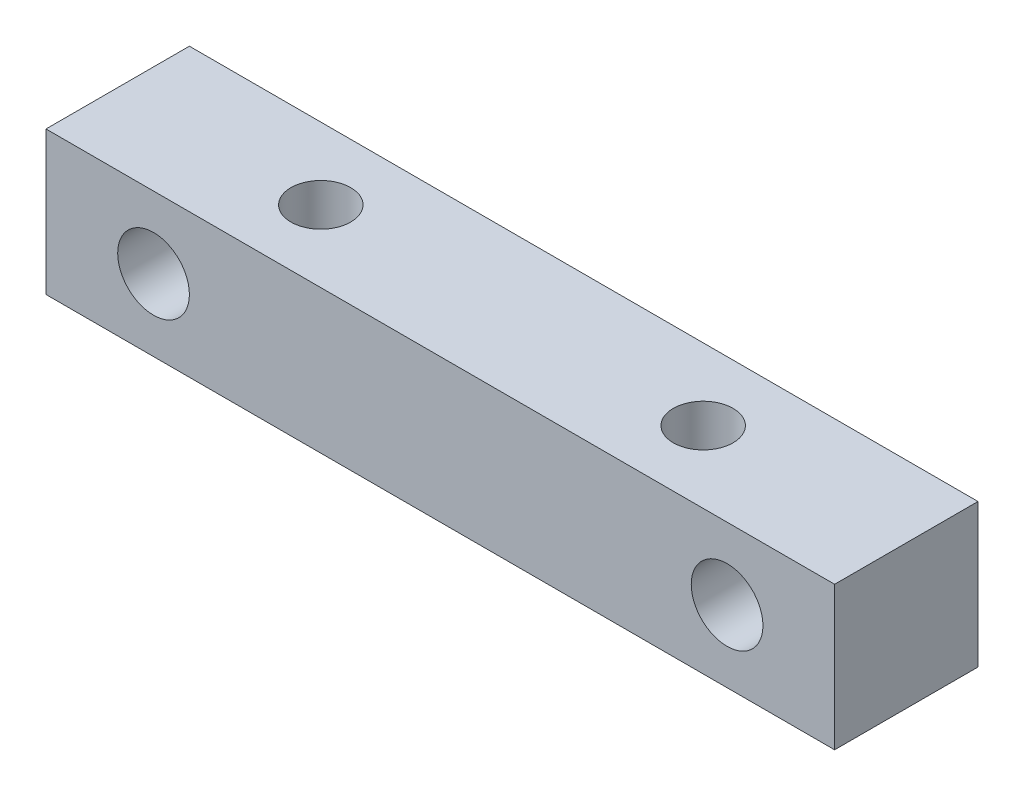
ISO-10303-21;
HEADER;
FILE_DESCRIPTION(('STEP AP214'),'2;1');
FILE_NAME('part.step','',(''),(''),'','','');
FILE_SCHEMA(('AUTOMOTIVE_DESIGN { 1 0 10303 214 1 1 1 1 }'));
ENDSEC;
DATA;
#1=APPLICATION_CONTEXT('core data for automotive mechanical design processes');
#2=APPLICATION_PROTOCOL_DEFINITION('international standard','automotive_design',2000,#1);
#3=PRODUCT_CONTEXT('',#1,'mechanical');
#4=PRODUCT('Part','Part','',(#3));
#5=PRODUCT_RELATED_PRODUCT_CATEGORY('part','',(#4));
#6=PRODUCT_DEFINITION_FORMATION('','',#4);
#7=PRODUCT_DEFINITION_CONTEXT('part definition',#1,'design');
#8=PRODUCT_DEFINITION('design','',#6,#7);
#9=PRODUCT_DEFINITION_SHAPE('','',#8);
#10=(LENGTH_UNIT() NAMED_UNIT(*) SI_UNIT(.MILLI.,.METRE.));
#11=(NAMED_UNIT(*) PLANE_ANGLE_UNIT() SI_UNIT($,.RADIAN.));
#12=(NAMED_UNIT(*) SI_UNIT($,.STERADIAN.) SOLID_ANGLE_UNIT());
#13=UNCERTAINTY_MEASURE_WITH_UNIT(LENGTH_MEASURE(1.E-05),#10,'distance_accuracy_value','');
#14=(GEOMETRIC_REPRESENTATION_CONTEXT(3) GLOBAL_UNCERTAINTY_ASSIGNED_CONTEXT((#13)) GLOBAL_UNIT_ASSIGNED_CONTEXT((#10,
#11,#12)) REPRESENTATION_CONTEXT('',''));
#15=CARTESIAN_POINT('',(0.,0.,0.));
#16=DIRECTION('',(0.,0.,1.));
#17=DIRECTION('',(1.,0.,0.));
#18=AXIS2_PLACEMENT_3D('',#15,#16,#17);
#19=CARTESIAN_POINT('',(0.,0.,6.));
#20=DIRECTION('',(0.,0.,1.));
#21=DIRECTION('',(1.,0.,0.));
#22=AXIS2_PLACEMENT_3D('',#19,#20,#21);
#23=PLANE('',#22);
#24=DIRECTION('',(0.,1.,0.));
#25=VECTOR('',#24,1.);
#26=CARTESIAN_POINT('',(-16.5,0.,6.));
#27=LINE('',#26,#25);
#28=CARTESIAN_POINT('',(-16.5,-21.,6.));
#29=VERTEX_POINT('',#28);
#30=CARTESIAN_POINT('',(-16.5,-15.,6.));
#31=VERTEX_POINT('',#30);
#32=EDGE_CURVE('E107',#29,#31,#27,.T.);
#33=ORIENTED_EDGE('',*,*,#32,.F.);
#34=DIRECTION('',(-1.,0.,0.));
#35=VECTOR('',#34,1.);
#36=CARTESIAN_POINT('',(26.5,-21.,6.));
#37=LINE('',#36,#35);
#38=CARTESIAN_POINT('',(16.5,-21.,6.));
#39=VERTEX_POINT('',#38);
#40=EDGE_CURVE('E127',#39,#29,#37,.T.);
#41=ORIENTED_EDGE('',*,*,#40,.F.);
#42=DIRECTION('',(0.,-1.,0.));
#43=VECTOR('',#42,1.);
#44=CARTESIAN_POINT('',(16.5,0.,6.));
#45=LINE('',#44,#43);
#46=CARTESIAN_POINT('',(16.5,-15.,6.));
#47=VERTEX_POINT('',#46);
#48=EDGE_CURVE('E81',#47,#39,#45,.T.);
#49=ORIENTED_EDGE('',*,*,#48,.F.);
#50=DIRECTION('',(1.,0.,0.));
#51=VECTOR('',#50,1.);
#52=CARTESIAN_POINT('',(-22.5,-15.,6.));
#53=LINE('',#52,#51);
#54=EDGE_CURVE('E126',#31,#47,#53,.T.);
#55=ORIENTED_EDGE('',*,*,#54,.F.);
#56=EDGE_LOOP('',(#33,#41,#49,#55));
#57=FACE_BOUND('',#56,.T.);
#58=CARTESIAN_POINT('',(-12.,-18.,6.));
#59=DIRECTION('',(0.,0.,1.));
#60=DIRECTION('',(1.,0.,0.));
#61=AXIS2_PLACEMENT_3D('',#58,#59,#60);
#62=CIRCLE('',#61,1.5);
#63=CARTESIAN_POINT('',(-10.5,-18.,6.));
#64=VERTEX_POINT('',#63);
#65=EDGE_CURVE('E139',#64,#64,#62,.T.);
#66=ORIENTED_EDGE('',*,*,#65,.F.);
#67=EDGE_LOOP('',(#66));
#68=FACE_BOUND('',#67,.T.);
#69=CARTESIAN_POINT('',(12.,-18.,6.));
#70=DIRECTION('',(0.,0.,1.));
#71=DIRECTION('',(1.,0.,0.));
#72=AXIS2_PLACEMENT_3D('',#69,#70,#71);
#73=CIRCLE('',#72,1.5);
#74=CARTESIAN_POINT('',(13.5,-18.,6.));
#75=VERTEX_POINT('',#74);
#76=EDGE_CURVE('E141',#75,#75,#73,.T.);
#77=ORIENTED_EDGE('',*,*,#76,.F.);
#78=EDGE_LOOP('',(#77));
#79=FACE_BOUND('',#78,.T.);
#80=ADVANCED_FACE('F66',(#57,#68,#79),#23,.T.);
#81=CARTESIAN_POINT('',(0.,0.,0.));
#82=DIRECTION('',(0.,0.,1.));
#83=DIRECTION('',(1.,0.,0.));
#84=AXIS2_PLACEMENT_3D('',#81,#82,#83);
#85=PLANE('',#84);
#86=CARTESIAN_POINT('',(-12.,-18.,0.));
#87=DIRECTION('',(0.,0.,-1.));
#88=DIRECTION('',(-1.,0.,0.));
#89=AXIS2_PLACEMENT_3D('',#86,#87,#88);
#90=CIRCLE('',#89,1.5);
#91=CARTESIAN_POINT('',(-13.5,-18.,0.));
#92=VERTEX_POINT('',#91);
#93=EDGE_CURVE('E146',#92,#92,#90,.T.);
#94=ORIENTED_EDGE('',*,*,#93,.F.);
#95=EDGE_LOOP('',(#94));
#96=FACE_BOUND('',#95,.T.);
#97=CARTESIAN_POINT('',(12.,-18.,0.));
#98=DIRECTION('',(0.,0.,-1.));
#99=DIRECTION('',(-1.,0.,0.));
#100=AXIS2_PLACEMENT_3D('',#97,#98,#99);
#101=CIRCLE('',#100,1.5);
#102=CARTESIAN_POINT('',(10.5,-18.,0.));
#103=VERTEX_POINT('',#102);
#104=EDGE_CURVE('E147',#103,#103,#101,.T.);
#105=ORIENTED_EDGE('',*,*,#104,.F.);
#106=EDGE_LOOP('',(#105));
#107=FACE_BOUND('',#106,.T.);
#108=DIRECTION('',(-1.,0.,0.));
#109=VECTOR('',#108,1.);
#110=CARTESIAN_POINT('',(26.5,-21.,0.));
#111=LINE('',#110,#109);
#112=CARTESIAN_POINT('',(16.5,-21.,0.));
#113=VERTEX_POINT('',#112);
#114=CARTESIAN_POINT('',(-16.5,-21.,0.));
#115=VERTEX_POINT('',#114);
#116=EDGE_CURVE('E119',#113,#115,#111,.T.);
#117=ORIENTED_EDGE('',*,*,#116,.T.);
#118=DIRECTION('',(0.,-1.,0.));
#119=VECTOR('',#118,1.);
#120=CARTESIAN_POINT('',(-16.5,-15.,0.));
#121=LINE('',#120,#119);
#122=CARTESIAN_POINT('',(-16.5,-15.,0.));
#123=VERTEX_POINT('',#122);
#124=EDGE_CURVE('E88',#123,#115,#121,.T.);
#125=ORIENTED_EDGE('',*,*,#124,.F.);
#126=DIRECTION('',(1.,0.,0.));
#127=VECTOR('',#126,1.);
#128=CARTESIAN_POINT('',(-22.5,-15.,0.));
#129=LINE('',#128,#127);
#130=CARTESIAN_POINT('',(16.5,-15.,0.));
#131=VERTEX_POINT('',#130);
#132=EDGE_CURVE('E117',#123,#131,#129,.T.);
#133=ORIENTED_EDGE('',*,*,#132,.T.);
#134=DIRECTION('',(0.,1.,0.));
#135=VECTOR('',#134,1.);
#136=CARTESIAN_POINT('',(16.5,-15.,0.));
#137=LINE('',#136,#135);
#138=EDGE_CURVE('E120',#113,#131,#137,.T.);
#139=ORIENTED_EDGE('',*,*,#138,.F.);
#140=EDGE_LOOP('',(#117,#125,#133,#139));
#141=FACE_BOUND('',#140,.T.);
#142=ADVANCED_FACE('F68',(#96,#107,#141),#85,.F.);
#143=CARTESIAN_POINT('',(-22.5,-15.,6.));
#144=DIRECTION('',(0.,1.,0.));
#145=DIRECTION('',(0.,0.,1.));
#146=AXIS2_PLACEMENT_3D('',#143,#144,#145);
#147=PLANE('',#146);
#148=DIRECTION('',(0.,0.,-1.));
#149=VECTOR('',#148,1.);
#150=CARTESIAN_POINT('',(-16.5,-15.,10.));
#151=LINE('',#150,#149);
#152=EDGE_CURVE('E104',#31,#123,#151,.T.);
#153=ORIENTED_EDGE('',*,*,#152,.F.);
#154=ORIENTED_EDGE('',*,*,#54,.T.);
#155=DIRECTION('',(0.,0.,-1.));
#156=VECTOR('',#155,1.);
#157=CARTESIAN_POINT('',(16.5,-15.,10.));
#158=LINE('',#157,#156);
#159=EDGE_CURVE('E125',#47,#131,#158,.T.);
#160=ORIENTED_EDGE('',*,*,#159,.T.);
#161=ORIENTED_EDGE('',*,*,#132,.F.);
#162=EDGE_LOOP('',(#153,#154,#160,#161));
#163=FACE_BOUND('',#162,.T.);
#164=CARTESIAN_POINT('',(8.,-15.,3.));
#165=DIRECTION('',(0.,1.,0.));
#166=DIRECTION('',(0.,0.,1.));
#167=AXIS2_PLACEMENT_3D('',#164,#165,#166);
#168=CIRCLE('',#167,1.25);
#169=CARTESIAN_POINT('',(8.,-15.,4.25));
#170=VERTEX_POINT('',#169);
#171=EDGE_CURVE('E150',#170,#170,#168,.T.);
#172=ORIENTED_EDGE('',*,*,#171,.F.);
#173=EDGE_LOOP('',(#172));
#174=FACE_BOUND('',#173,.T.);
#175=CARTESIAN_POINT('',(-8.,-15.,3.));
#176=DIRECTION('',(0.,1.,0.));
#177=DIRECTION('',(0.,0.,1.));
#178=AXIS2_PLACEMENT_3D('',#175,#176,#177);
#179=CIRCLE('',#178,1.25);
#180=CARTESIAN_POINT('',(-8.,-15.,4.25));
#181=VERTEX_POINT('',#180);
#182=EDGE_CURVE('E155',#181,#181,#179,.T.);
#183=ORIENTED_EDGE('',*,*,#182,.F.);
#184=EDGE_LOOP('',(#183));
#185=FACE_BOUND('',#184,.T.);
#186=ADVANCED_FACE('F123',(#163,#174,#185),#147,.T.);
#187=CARTESIAN_POINT('',(26.5,-21.,6.));
#188=DIRECTION('',(0.,-1.,0.));
#189=DIRECTION('',(0.,0.,-1.));
#190=AXIS2_PLACEMENT_3D('',#187,#188,#189);
#191=PLANE('',#190);
#192=DIRECTION('',(0.,0.,1.));
#193=VECTOR('',#192,1.);
#194=CARTESIAN_POINT('',(-16.5,-21.,6.));
#195=LINE('',#194,#193);
#196=EDGE_CURVE('E12',#115,#29,#195,.T.);
#197=ORIENTED_EDGE('',*,*,#196,.F.);
#198=ORIENTED_EDGE('',*,*,#116,.F.);
#199=DIRECTION('',(0.,0.,-1.));
#200=VECTOR('',#199,1.);
#201=CARTESIAN_POINT('',(16.5,-21.,6.));
#202=LINE('',#201,#200);
#203=EDGE_CURVE('E74',#39,#113,#202,.T.);
#204=ORIENTED_EDGE('',*,*,#203,.F.);
#205=ORIENTED_EDGE('',*,*,#40,.T.);
#206=EDGE_LOOP('',(#197,#198,#204,#205));
#207=FACE_BOUND('',#206,.T.);
#208=CARTESIAN_POINT('',(8.,-21.,3.));
#209=DIRECTION('',(0.,-1.,0.));
#210=DIRECTION('',(0.,0.,-1.));
#211=AXIS2_PLACEMENT_3D('',#208,#209,#210);
#212=CIRCLE('',#211,1.25);
#213=CARTESIAN_POINT('',(8.,-21.,1.75));
#214=VERTEX_POINT('',#213);
#215=EDGE_CURVE('E158',#214,#214,#212,.T.);
#216=ORIENTED_EDGE('',*,*,#215,.F.);
#217=EDGE_LOOP('',(#216));
#218=FACE_BOUND('',#217,.T.);
#219=CARTESIAN_POINT('',(-8.,-21.,3.));
#220=DIRECTION('',(0.,-1.,0.));
#221=DIRECTION('',(0.,0.,-1.));
#222=AXIS2_PLACEMENT_3D('',#219,#220,#221);
#223=CIRCLE('',#222,1.25);
#224=CARTESIAN_POINT('',(-8.,-21.,1.75));
#225=VERTEX_POINT('',#224);
#226=EDGE_CURVE('E159',#225,#225,#223,.T.);
#227=ORIENTED_EDGE('',*,*,#226,.F.);
#228=EDGE_LOOP('',(#227));
#229=FACE_BOUND('',#228,.T.);
#230=ADVANCED_FACE('F137',(#207,#218,#229),#191,.T.);
#231=CARTESIAN_POINT('',(12.,-18.,59.));
#232=DIRECTION('',(0.,0.,-1.));
#233=DIRECTION('',(-1.,0.,0.));
#234=AXIS2_PLACEMENT_3D('',#231,#232,#233);
#235=CYLINDRICAL_SURFACE('',#234,1.5);
#236=ORIENTED_EDGE('',*,*,#76,.T.);
#237=EDGE_LOOP('',(#236));
#238=FACE_BOUND('',#237,.T.);
#239=ORIENTED_EDGE('',*,*,#104,.T.);
#240=EDGE_LOOP('',(#239));
#241=FACE_BOUND('',#240,.T.);
#242=ADVANCED_FACE('F171',(#238,#241),#235,.F.);
#243=CARTESIAN_POINT('',(-12.,-18.,59.));
#244=DIRECTION('',(0.,0.,-1.));
#245=DIRECTION('',(-1.,0.,0.));
#246=AXIS2_PLACEMENT_3D('',#243,#244,#245);
#247=CYLINDRICAL_SURFACE('',#246,1.5);
#248=ORIENTED_EDGE('',*,*,#65,.T.);
#249=EDGE_LOOP('',(#248));
#250=FACE_BOUND('',#249,.T.);
#251=ORIENTED_EDGE('',*,*,#93,.T.);
#252=EDGE_LOOP('',(#251));
#253=FACE_BOUND('',#252,.T.);
#254=ADVANCED_FACE('F177',(#250,#253),#247,.F.);
#255=CARTESIAN_POINT('',(-8.,-11.,3.));
#256=DIRECTION('',(0.,-1.,0.));
#257=DIRECTION('',(0.,0.,-1.));
#258=AXIS2_PLACEMENT_3D('',#255,#256,#257);
#259=CYLINDRICAL_SURFACE('',#258,1.25);
#260=ORIENTED_EDGE('',*,*,#182,.T.);
#261=EDGE_LOOP('',(#260));
#262=FACE_BOUND('',#261,.T.);
#263=ORIENTED_EDGE('',*,*,#226,.T.);
#264=EDGE_LOOP('',(#263));
#265=FACE_BOUND('',#264,.T.);
#266=ADVANCED_FACE('F175',(#262,#265),#259,.F.);
#267=CARTESIAN_POINT('',(8.,-11.,3.));
#268=DIRECTION('',(0.,-1.,0.));
#269=DIRECTION('',(0.,0.,-1.));
#270=AXIS2_PLACEMENT_3D('',#267,#268,#269);
#271=CYLINDRICAL_SURFACE('',#270,1.25);
#272=ORIENTED_EDGE('',*,*,#171,.T.);
#273=EDGE_LOOP('',(#272));
#274=FACE_BOUND('',#273,.T.);
#275=ORIENTED_EDGE('',*,*,#215,.T.);
#276=EDGE_LOOP('',(#275));
#277=FACE_BOUND('',#276,.T.);
#278=ADVANCED_FACE('F168',(#274,#277),#271,.F.);
#279=CARTESIAN_POINT('',(16.5,-15.,10.));
#280=DIRECTION('',(-1.,0.,0.));
#281=DIRECTION('',(0.,-1.,0.));
#282=AXIS2_PLACEMENT_3D('',#279,#280,#281);
#283=PLANE('',#282);
#284=ORIENTED_EDGE('',*,*,#48,.T.);
#285=ORIENTED_EDGE('',*,*,#203,.T.);
#286=ORIENTED_EDGE('',*,*,#138,.T.);
#287=ORIENTED_EDGE('',*,*,#159,.F.);
#288=EDGE_LOOP('',(#284,#285,#286,#287));
#289=FACE_BOUND('',#288,.T.);
#290=ADVANCED_FACE('F133',(#289),#283,.F.);
#291=CARTESIAN_POINT('',(-16.5,-15.,10.));
#292=DIRECTION('',(1.,0.,0.));
#293=DIRECTION('',(0.,1.,0.));
#294=AXIS2_PLACEMENT_3D('',#291,#292,#293);
#295=PLANE('',#294);
#296=ORIENTED_EDGE('',*,*,#32,.T.);
#297=ORIENTED_EDGE('',*,*,#152,.T.);
#298=ORIENTED_EDGE('',*,*,#124,.T.);
#299=ORIENTED_EDGE('',*,*,#196,.T.);
#300=EDGE_LOOP('',(#296,#297,#298,#299));
#301=FACE_BOUND('',#300,.T.);
#302=ADVANCED_FACE('F105',(#301),#295,.F.);
#303=CLOSED_SHELL('',(#80,#142,#186,#230,#242,#254,#266,#278,#290,#302));
#304=MANIFOLD_SOLID_BREP('B2',#303);
#305=ADVANCED_BREP_SHAPE_REPRESENTATION('',(#18,#304),#14);
#306=SHAPE_DEFINITION_REPRESENTATION(#9,#305);
ENDSEC;
END-ISO-10303-21;
